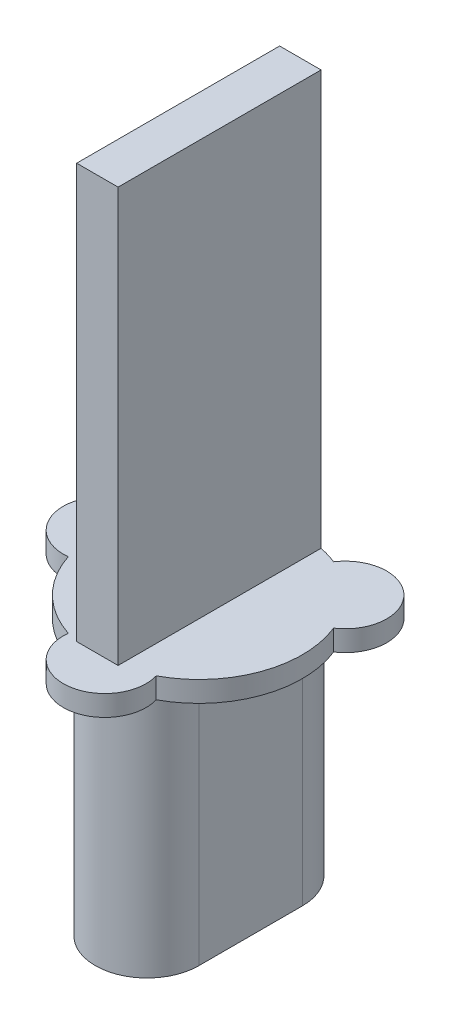
ISO-10303-21;
HEADER;
FILE_DESCRIPTION(('STEP AP214'),'2;1');
FILE_NAME('part.step','',(''),(''),'','','');
FILE_SCHEMA(('AUTOMOTIVE_DESIGN { 1 0 10303 214 1 1 1 1 }'));
ENDSEC;
DATA;
#1=APPLICATION_CONTEXT('core data for automotive mechanical design processes');
#2=APPLICATION_PROTOCOL_DEFINITION('international standard','automotive_design',2000,#1);
#3=PRODUCT_CONTEXT('',#1,'mechanical');
#4=PRODUCT('Part','Part','',(#3));
#5=PRODUCT_RELATED_PRODUCT_CATEGORY('part','',(#4));
#6=PRODUCT_DEFINITION_FORMATION('','',#4);
#7=PRODUCT_DEFINITION_CONTEXT('part definition',#1,'design');
#8=PRODUCT_DEFINITION('design','',#6,#7);
#9=PRODUCT_DEFINITION_SHAPE('','',#8);
#10=(LENGTH_UNIT() NAMED_UNIT(*) SI_UNIT(.MILLI.,.METRE.));
#11=(NAMED_UNIT(*) PLANE_ANGLE_UNIT() SI_UNIT($,.RADIAN.));
#12=(NAMED_UNIT(*) SI_UNIT($,.STERADIAN.) SOLID_ANGLE_UNIT());
#13=UNCERTAINTY_MEASURE_WITH_UNIT(LENGTH_MEASURE(1.E-05),#10,'distance_accuracy_value','');
#14=(GEOMETRIC_REPRESENTATION_CONTEXT(3) GLOBAL_UNCERTAINTY_ASSIGNED_CONTEXT((#13)) GLOBAL_UNIT_ASSIGNED_CONTEXT((#10,
#11,#12)) REPRESENTATION_CONTEXT('',''));
#15=CARTESIAN_POINT('',(0.,0.,0.));
#16=DIRECTION('',(0.,0.,1.));
#17=DIRECTION('',(1.,0.,0.));
#18=AXIS2_PLACEMENT_3D('',#15,#16,#17);
#19=CARTESIAN_POINT('',(0.,0.,-2.5));
#20=DIRECTION('',(0.,1.,0.));
#21=DIRECTION('',(0.,0.,1.));
#22=AXIS2_PLACEMENT_3D('',#19,#20,#21);
#23=PLANE('',#22);
#24=CARTESIAN_POINT('',(0.,0.,0.));
#25=DIRECTION('',(0.,1.,0.));
#26=DIRECTION('',(0.,0.,1.));
#27=AXIS2_PLACEMENT_3D('',#24,#25,#26);
#28=CIRCLE('',#27,5.);
#29=CARTESIAN_POINT('',(1.,0.,-4.89897948556636));
#30=VERTEX_POINT('',#29);
#31=CARTESIAN_POINT('',(-1.,0.,-4.89897948556636));
#32=VERTEX_POINT('',#31);
#33=EDGE_CURVE('E194',#30,#32,#28,.T.);
#34=ORIENTED_EDGE('',*,*,#33,.T.);
#35=DIRECTION('',(1.,0.,0.));
#36=VECTOR('',#35,1.);
#37=CARTESIAN_POINT('',(-0.999999999999999,0.,-4.89897948556636));
#38=LINE('',#37,#36);
#39=EDGE_CURVE('E321',#32,#30,#38,.T.);
#40=ORIENTED_EDGE('',*,*,#39,.T.);
#41=EDGE_LOOP('',(#34,#40));
#42=FACE_BOUND('',#41,.T.);
#43=ADVANCED_FACE('F66',(#42),#23,.T.);
#44=CARTESIAN_POINT('',(0.,-13.,-2.5));
#45=DIRECTION('',(0.,1.,0.));
#46=DIRECTION('',(0.,0.,1.));
#47=AXIS2_PLACEMENT_3D('',#44,#45,#46);
#48=CYLINDRICAL_SURFACE('',#47,2.5);
#49=CARTESIAN_POINT('',(0.,-0.999999999999999,-2.5));
#50=DIRECTION('',(0.,1.,0.));
#51=DIRECTION('',(0.,0.,1.));
#52=AXIS2_PLACEMENT_3D('',#49,#50,#51);
#53=CIRCLE('',#52,2.5);
#54=CARTESIAN_POINT('',(-2.5,-1.,-2.5));
#55=VERTEX_POINT('',#54);
#56=CARTESIAN_POINT('',(0.,-1.,-5.));
#57=VERTEX_POINT('',#56);
#58=EDGE_CURVE('E244',#55,#57,#53,.F.);
#59=ORIENTED_EDGE('',*,*,#58,.T.);
#60=CARTESIAN_POINT('',(2.5,-0.999999999999999,-2.5));
#61=VERTEX_POINT('',#60);
#62=EDGE_CURVE('E247',#57,#61,#53,.F.);
#63=ORIENTED_EDGE('',*,*,#62,.T.);
#64=DIRECTION('',(0.,1.,0.));
#65=VECTOR('',#64,1.);
#66=CARTESIAN_POINT('',(2.5,-13.,-2.5));
#67=LINE('',#66,#65);
#68=CARTESIAN_POINT('',(2.5,-13.,-2.5));
#69=VERTEX_POINT('',#68);
#70=EDGE_CURVE('E74',#69,#61,#67,.T.);
#71=ORIENTED_EDGE('',*,*,#70,.F.);
#72=CARTESIAN_POINT('',(0.,-13.,-2.5));
#73=DIRECTION('',(0.,1.,0.));
#74=DIRECTION('',(0.,0.,1.));
#75=AXIS2_PLACEMENT_3D('',#72,#73,#74);
#76=CIRCLE('',#75,2.5);
#77=CARTESIAN_POINT('',(-2.5,-13.,-2.5));
#78=VERTEX_POINT('',#77);
#79=EDGE_CURVE('E248',#69,#78,#76,.T.);
#80=ORIENTED_EDGE('',*,*,#79,.T.);
#81=DIRECTION('',(0.,1.,0.));
#82=VECTOR('',#81,1.);
#83=CARTESIAN_POINT('',(-2.5,-13.,-2.5));
#84=LINE('',#83,#82);
#85=EDGE_CURVE('E259',#78,#55,#84,.T.);
#86=ORIENTED_EDGE('',*,*,#85,.T.);
#87=EDGE_LOOP('',(#59,#63,#71,#80,#86));
#88=FACE_BOUND('',#87,.T.);
#89=ADVANCED_FACE('F68',(#88),#48,.T.);
#90=CARTESIAN_POINT('',(2.5,-13.,-2.5));
#91=DIRECTION('',(-1.,0.,0.));
#92=DIRECTION('',(0.,0.,1.));
#93=AXIS2_PLACEMENT_3D('',#90,#91,#92);
#94=PLANE('',#93);
#95=DIRECTION('',(0.,0.,-1.));
#96=VECTOR('',#95,1.);
#97=CARTESIAN_POINT('',(2.5,-0.999999999999999,-2.5));
#98=LINE('',#97,#96);
#99=CARTESIAN_POINT('',(2.50000000000001,-0.999999999999999,2.5));
#100=VERTEX_POINT('',#99);
#101=EDGE_CURVE('E242',#100,#61,#98,.T.);
#102=ORIENTED_EDGE('',*,*,#101,.F.);
#103=DIRECTION('',(0.,1.,0.));
#104=VECTOR('',#103,1.);
#105=CARTESIAN_POINT('',(2.50000000000001,-13.,2.5));
#106=LINE('',#105,#104);
#107=CARTESIAN_POINT('',(2.50000000000001,-13.,2.5));
#108=VERTEX_POINT('',#107);
#109=EDGE_CURVE('E262',#108,#100,#106,.T.);
#110=ORIENTED_EDGE('',*,*,#109,.F.);
#111=DIRECTION('',(0.,0.,1.));
#112=VECTOR('',#111,1.);
#113=CARTESIAN_POINT('',(2.5,-13.,-2.5));
#114=LINE('',#113,#112);
#115=EDGE_CURVE('E257',#69,#108,#114,.T.);
#116=ORIENTED_EDGE('',*,*,#115,.F.);
#117=ORIENTED_EDGE('',*,*,#70,.T.);
#118=EDGE_LOOP('',(#102,#110,#116,#117));
#119=FACE_BOUND('',#118,.T.);
#120=ADVANCED_FACE('F285',(#119),#94,.F.);
#121=CARTESIAN_POINT('',(0.,-13.,2.5));
#122=DIRECTION('',(0.,1.,0.));
#123=DIRECTION('',(0.,0.,1.));
#124=AXIS2_PLACEMENT_3D('',#121,#122,#123);
#125=CYLINDRICAL_SURFACE('',#124,2.5);
#126=ORIENTED_EDGE('',*,*,#109,.T.);
#127=CARTESIAN_POINT('',(0.,-0.999999999999999,2.5));
#128=DIRECTION('',(0.,1.,0.));
#129=DIRECTION('',(0.,0.,1.));
#130=AXIS2_PLACEMENT_3D('',#127,#128,#129);
#131=CIRCLE('',#130,2.5);
#132=CARTESIAN_POINT('',(-2.5,-0.999999999999999,2.5));
#133=VERTEX_POINT('',#132);
#134=EDGE_CURVE('E209',#100,#133,#131,.F.);
#135=ORIENTED_EDGE('',*,*,#134,.T.);
#136=DIRECTION('',(0.,1.,0.));
#137=VECTOR('',#136,1.);
#138=CARTESIAN_POINT('',(-2.5,-13.,2.5));
#139=LINE('',#138,#137);
#140=CARTESIAN_POINT('',(-2.5,-13.,2.5));
#141=VERTEX_POINT('',#140);
#142=EDGE_CURVE('E265',#141,#133,#139,.T.);
#143=ORIENTED_EDGE('',*,*,#142,.F.);
#144=CARTESIAN_POINT('',(0.,-13.,2.5));
#145=DIRECTION('',(0.,1.,0.));
#146=DIRECTION('',(0.,0.,1.));
#147=AXIS2_PLACEMENT_3D('',#144,#145,#146);
#148=CIRCLE('',#147,2.5);
#149=EDGE_CURVE('E254',#141,#108,#148,.T.);
#150=ORIENTED_EDGE('',*,*,#149,.T.);
#151=EDGE_LOOP('',(#126,#135,#143,#150));
#152=FACE_BOUND('',#151,.T.);
#153=ADVANCED_FACE('F280',(#152),#125,.T.);
#154=CARTESIAN_POINT('',(-2.5,-13.,-2.5));
#155=DIRECTION('',(-1.,0.,0.));
#156=DIRECTION('',(0.,0.,1.));
#157=AXIS2_PLACEMENT_3D('',#154,#155,#156);
#158=PLANE('',#157);
#159=ORIENTED_EDGE('',*,*,#142,.T.);
#160=DIRECTION('',(0.,0.,-1.));
#161=VECTOR('',#160,1.);
#162=CARTESIAN_POINT('',(-2.5,-0.999999999999999,-2.5));
#163=LINE('',#162,#161);
#164=EDGE_CURVE('E12',#133,#55,#163,.T.);
#165=ORIENTED_EDGE('',*,*,#164,.T.);
#166=ORIENTED_EDGE('',*,*,#85,.F.);
#167=DIRECTION('',(0.,0.,1.));
#168=VECTOR('',#167,1.);
#169=CARTESIAN_POINT('',(-2.5,-13.,-2.5));
#170=LINE('',#169,#168);
#171=EDGE_CURVE('E251',#78,#141,#170,.T.);
#172=ORIENTED_EDGE('',*,*,#171,.T.);
#173=EDGE_LOOP('',(#159,#165,#166,#172));
#174=FACE_BOUND('',#173,.T.);
#175=ADVANCED_FACE('F273',(#174),#158,.T.);
#176=CARTESIAN_POINT('',(0.,-13.,-2.5));
#177=DIRECTION('',(0.,1.,0.));
#178=DIRECTION('',(0.,0.,1.));
#179=AXIS2_PLACEMENT_3D('',#176,#177,#178);
#180=PLANE('',#179);
#181=ORIENTED_EDGE('',*,*,#79,.F.);
#182=ORIENTED_EDGE('',*,*,#115,.T.);
#183=ORIENTED_EDGE('',*,*,#149,.F.);
#184=ORIENTED_EDGE('',*,*,#171,.F.);
#185=EDGE_LOOP('',(#181,#182,#183,#184));
#186=FACE_BOUND('',#185,.T.);
#187=ADVANCED_FACE('F276',(#186),#180,.F.);
#188=CARTESIAN_POINT('',(0.,-1.,0.));
#189=DIRECTION('',(0.,1.,0.));
#190=DIRECTION('',(0.,0.,1.));
#191=AXIS2_PLACEMENT_3D('',#188,#189,#190);
#192=CYLINDRICAL_SURFACE('',#191,5.);
#193=DIRECTION('',(0.,1.,0.));
#194=VECTOR('',#193,1.);
#195=CARTESIAN_POINT('',(-4.41170593291399,-1.,-2.35305137247182));
#196=LINE('',#195,#194);
#197=CARTESIAN_POINT('',(-4.41170593291399,-1.,-2.35305137247182));
#198=VERTEX_POINT('',#197);
#199=CARTESIAN_POINT('',(-4.41170593291399,0.,-2.35305137247182));
#200=VERTEX_POINT('',#199);
#201=EDGE_CURVE('E214',#198,#200,#196,.T.);
#202=ORIENTED_EDGE('',*,*,#201,.T.);
#203=EDGE_CURVE('E239',#32,#200,#28,.T.);
#204=ORIENTED_EDGE('',*,*,#203,.F.);
#205=ORIENTED_EDGE('',*,*,#33,.F.);
#206=CARTESIAN_POINT('',(1.86705054740302,0.,-4.63833183951322));
#207=VERTEX_POINT('',#206);
#208=EDGE_CURVE('E236',#207,#30,#28,.T.);
#209=ORIENTED_EDGE('',*,*,#208,.F.);
#210=DIRECTION('',(0.,1.,0.));
#211=VECTOR('',#210,1.);
#212=CARTESIAN_POINT('',(1.86705054740302,-1.,-4.63833183951322));
#213=LINE('',#212,#211);
#214=CARTESIAN_POINT('',(1.86705054740302,-1.,-4.63833183951322));
#215=VERTEX_POINT('',#214);
#216=EDGE_CURVE('E218',#215,#207,#213,.T.);
#217=ORIENTED_EDGE('',*,*,#216,.F.);
#218=CARTESIAN_POINT('',(0.,-1.,0.));
#219=DIRECTION('',(0.,1.,0.));
#220=DIRECTION('',(0.,0.,1.));
#221=AXIS2_PLACEMENT_3D('',#218,#219,#220);
#222=CIRCLE('',#221,5.);
#223=EDGE_CURVE('E229',#215,#57,#222,.T.);
#224=ORIENTED_EDGE('',*,*,#223,.T.);
#225=EDGE_CURVE('E234',#57,#198,#222,.T.);
#226=ORIENTED_EDGE('',*,*,#225,.T.);
#227=EDGE_LOOP('',(#202,#204,#205,#209,#217,#224,#226));
#228=FACE_BOUND('',#227,.T.);
#229=ADVANCED_FACE('F293',(#228),#192,.T.);
#230=CARTESIAN_POINT('',(0.435778713738293,-1.,4.98097349045873));
#231=DIRECTION('',(0.,1.,0.));
#232=DIRECTION('',(0.,0.,1.));
#233=AXIS2_PLACEMENT_3D('',#230,#231,#232);
#234=CYLINDRICAL_SURFACE('',#233,2.);
#235=CARTESIAN_POINT('',(0.435778713738293,0.,4.98097349045873));
#236=DIRECTION('',(0.,1.,0.));
#237=DIRECTION('',(0.,0.,1.));
#238=AXIS2_PLACEMENT_3D('',#235,#236,#237);
#239=CIRCLE('',#238,2.);
#240=CARTESIAN_POINT('',(-1.55121853919334,0.,4.75328528953006));
#241=VERTEX_POINT('',#240);
#242=CARTESIAN_POINT('',(2.3530513724718,0.,4.411705932914));
#243=VERTEX_POINT('',#242);
#244=EDGE_CURVE('E203',#241,#243,#239,.T.);
#245=ORIENTED_EDGE('',*,*,#244,.F.);
#246=DIRECTION('',(0.,1.,0.));
#247=VECTOR('',#246,1.);
#248=CARTESIAN_POINT('',(-1.55121853919334,-1.,4.75328528953006));
#249=LINE('',#248,#247);
#250=CARTESIAN_POINT('',(-1.55121853919334,-1.,4.75328528953006));
#251=VERTEX_POINT('',#250);
#252=EDGE_CURVE('E202',#251,#241,#249,.T.);
#253=ORIENTED_EDGE('',*,*,#252,.F.);
#254=CARTESIAN_POINT('',(0.435778713738293,-1.,4.98097349045873));
#255=DIRECTION('',(0.,1.,0.));
#256=DIRECTION('',(0.,0.,1.));
#257=AXIS2_PLACEMENT_3D('',#254,#255,#256);
#258=CIRCLE('',#257,2.);
#259=CARTESIAN_POINT('',(2.3530513724718,-1.,4.411705932914));
#260=VERTEX_POINT('',#259);
#261=EDGE_CURVE('E199',#251,#260,#258,.T.);
#262=ORIENTED_EDGE('',*,*,#261,.T.);
#263=DIRECTION('',(0.,1.,0.));
#264=VECTOR('',#263,1.);
#265=CARTESIAN_POINT('',(2.3530513724718,-1.,4.411705932914));
#266=LINE('',#265,#264);
#267=EDGE_CURVE('E207',#260,#243,#266,.T.);
#268=ORIENTED_EDGE('',*,*,#267,.T.);
#269=EDGE_LOOP('',(#245,#253,#262,#268));
#270=FACE_BOUND('',#269,.T.);
#271=ADVANCED_FACE('F305',(#270),#234,.T.);
#272=CARTESIAN_POINT('',(0.,-1.,0.));
#273=DIRECTION('',(0.,1.,0.));
#274=DIRECTION('',(0.,0.,1.));
#275=AXIS2_PLACEMENT_3D('',#272,#273,#274);
#276=PLANE('',#275);
#277=ORIENTED_EDGE('',*,*,#62,.F.);
#278=ORIENTED_EDGE('',*,*,#223,.F.);
#279=CARTESIAN_POINT('',(3.53553390593274,-1.,-3.53553390593274));
#280=DIRECTION('',(0.,1.,0.));
#281=DIRECTION('',(0.,0.,1.));
#282=AXIS2_PLACEMENT_3D('',#279,#280,#281);
#283=CIRCLE('',#282,2.);
#284=CARTESIAN_POINT('',(4.63833183951322,-1.,-1.86705054740301));
#285=VERTEX_POINT('',#284);
#286=EDGE_CURVE('E222',#285,#215,#283,.T.);
#287=ORIENTED_EDGE('',*,*,#286,.F.);
#288=EDGE_CURVE('E238',#260,#285,#222,.T.);
#289=ORIENTED_EDGE('',*,*,#288,.F.);
#290=ORIENTED_EDGE('',*,*,#261,.F.);
#291=CARTESIAN_POINT('',(-4.75328528953006,-1.,1.55121853919333));
#292=VERTEX_POINT('',#291);
#293=EDGE_CURVE('E235',#292,#251,#222,.T.);
#294=ORIENTED_EDGE('',*,*,#293,.F.);
#295=CARTESIAN_POINT('',(-4.98097349045873,-1.,-0.435778713738309));
#296=DIRECTION('',(0.,1.,0.));
#297=DIRECTION('',(0.,0.,1.));
#298=AXIS2_PLACEMENT_3D('',#295,#296,#297);
#299=CIRCLE('',#298,2.);
#300=EDGE_CURVE('E211',#198,#292,#299,.T.);
#301=ORIENTED_EDGE('',*,*,#300,.F.);
#302=ORIENTED_EDGE('',*,*,#225,.F.);
#303=ORIENTED_EDGE('',*,*,#58,.F.);
#304=ORIENTED_EDGE('',*,*,#164,.F.);
#305=ORIENTED_EDGE('',*,*,#134,.F.);
#306=ORIENTED_EDGE('',*,*,#101,.T.);
#307=EDGE_LOOP('',(#277,#278,#287,#289,#290,#294,#301,#302,#303,#304,#305,#306));
#308=FACE_BOUND('',#307,.T.);
#309=ADVANCED_FACE('F283',(#308),#276,.F.);
#310=CARTESIAN_POINT('',(-4.98097349045873,-1.,-0.435778713738309));
#311=DIRECTION('',(0.,1.,0.));
#312=DIRECTION('',(0.,0.,1.));
#313=AXIS2_PLACEMENT_3D('',#310,#311,#312);
#314=CYLINDRICAL_SURFACE('',#313,2.);
#315=CARTESIAN_POINT('',(-4.98097349045873,0.,-0.435778713738309));
#316=DIRECTION('',(0.,1.,0.));
#317=DIRECTION('',(0.,0.,1.));
#318=AXIS2_PLACEMENT_3D('',#315,#316,#317);
#319=CIRCLE('',#318,2.);
#320=CARTESIAN_POINT('',(-4.75328528953006,0.,1.55121853919333));
#321=VERTEX_POINT('',#320);
#322=EDGE_CURVE('E215',#200,#321,#319,.T.);
#323=ORIENTED_EDGE('',*,*,#322,.F.);
#324=ORIENTED_EDGE('',*,*,#201,.F.);
#325=ORIENTED_EDGE('',*,*,#300,.T.);
#326=DIRECTION('',(0.,1.,0.));
#327=VECTOR('',#326,1.);
#328=CARTESIAN_POINT('',(-4.75328528953006,-1.,1.55121853919333));
#329=LINE('',#328,#327);
#330=EDGE_CURVE('E206',#292,#321,#329,.T.);
#331=ORIENTED_EDGE('',*,*,#330,.T.);
#332=EDGE_LOOP('',(#323,#324,#325,#331));
#333=FACE_BOUND('',#332,.T.);
#334=ADVANCED_FACE('F314',(#333),#314,.T.);
#335=CARTESIAN_POINT('',(3.53553390593274,-1.,-3.53553390593274));
#336=DIRECTION('',(0.,1.,0.));
#337=DIRECTION('',(0.,0.,1.));
#338=AXIS2_PLACEMENT_3D('',#335,#336,#337);
#339=CYLINDRICAL_SURFACE('',#338,2.);
#340=CARTESIAN_POINT('',(3.53553390593274,0.,-3.53553390593274));
#341=DIRECTION('',(0.,1.,0.));
#342=DIRECTION('',(0.,0.,1.));
#343=AXIS2_PLACEMENT_3D('',#340,#341,#342);
#344=CIRCLE('',#343,2.);
#345=CARTESIAN_POINT('',(4.63833183951322,0.,-1.86705054740301));
#346=VERTEX_POINT('',#345);
#347=EDGE_CURVE('E226',#346,#207,#344,.T.);
#348=ORIENTED_EDGE('',*,*,#347,.F.);
#349=DIRECTION('',(0.,1.,0.));
#350=VECTOR('',#349,1.);
#351=CARTESIAN_POINT('',(4.63833183951322,-1.,-1.86705054740301));
#352=LINE('',#351,#350);
#353=EDGE_CURVE('E225',#285,#346,#352,.T.);
#354=ORIENTED_EDGE('',*,*,#353,.F.);
#355=ORIENTED_EDGE('',*,*,#286,.T.);
#356=ORIENTED_EDGE('',*,*,#216,.T.);
#357=EDGE_LOOP('',(#348,#354,#355,#356));
#358=FACE_BOUND('',#357,.T.);
#359=ADVANCED_FACE('F298',(#358),#339,.T.);
#360=EDGE_CURVE('E190',#243,#346,#28,.T.);
#361=ORIENTED_EDGE('',*,*,#360,.F.);
#362=ORIENTED_EDGE('',*,*,#267,.F.);
#363=ORIENTED_EDGE('',*,*,#288,.T.);
#364=ORIENTED_EDGE('',*,*,#353,.T.);
#365=EDGE_LOOP('',(#361,#362,#363,#364));
#366=FACE_BOUND('',#365,.T.);
#367=ADVANCED_FACE('F343',(#366),#192,.T.);
#368=ORIENTED_EDGE('',*,*,#293,.T.);
#369=ORIENTED_EDGE('',*,*,#252,.T.);
#370=EDGE_CURVE('E192',#321,#241,#28,.T.);
#371=ORIENTED_EDGE('',*,*,#370,.F.);
#372=ORIENTED_EDGE('',*,*,#330,.F.);
#373=EDGE_LOOP('',(#368,#369,#371,#372));
#374=FACE_BOUND('',#373,.T.);
#375=ADVANCED_FACE('F311',(#374),#192,.T.);
#376=DIRECTION('',(1.,0.,0.));
#377=VECTOR('',#376,1.);
#378=CARTESIAN_POINT('',(-0.999999999999999,0.,4.89897948556636));
#379=LINE('',#378,#377);
#380=CARTESIAN_POINT('',(-0.999999999999999,0.,4.89897948556636));
#381=VERTEX_POINT('',#380);
#382=CARTESIAN_POINT('',(1.,0.,4.89897948556636));
#383=VERTEX_POINT('',#382);
#384=EDGE_CURVE('E81',#381,#383,#379,.T.);
#385=ORIENTED_EDGE('',*,*,#384,.F.);
#386=DIRECTION('',(0.,0.,-1.));
#387=VECTOR('',#386,1.);
#388=CARTESIAN_POINT('',(-0.999999999999999,0.,4.89897948556636));
#389=LINE('',#388,#387);
#390=EDGE_CURVE('E187',#381,#32,#389,.T.);
#391=ORIENTED_EDGE('',*,*,#390,.T.);
#392=ORIENTED_EDGE('',*,*,#203,.T.);
#393=ORIENTED_EDGE('',*,*,#322,.T.);
#394=ORIENTED_EDGE('',*,*,#370,.T.);
#395=ORIENTED_EDGE('',*,*,#244,.T.);
#396=ORIENTED_EDGE('',*,*,#360,.T.);
#397=ORIENTED_EDGE('',*,*,#347,.T.);
#398=ORIENTED_EDGE('',*,*,#208,.T.);
#399=DIRECTION('',(0.,0.,-1.));
#400=VECTOR('',#399,1.);
#401=CARTESIAN_POINT('',(1.,0.,4.89897948556636));
#402=LINE('',#401,#400);
#403=EDGE_CURVE('E86',#383,#30,#402,.T.);
#404=ORIENTED_EDGE('',*,*,#403,.F.);
#405=EDGE_LOOP('',(#385,#391,#392,#393,#394,#395,#396,#397,#398,#404));
#406=FACE_BOUND('',#405,.T.);
#407=ADVANCED_FACE('F335',(#406),#23,.T.);
#408=CARTESIAN_POINT('',(-0.999999999999999,20.,4.89897948556636));
#409=DIRECTION('',(0.,0.,-1.));
#410=DIRECTION('',(-1.,0.,0.));
#411=AXIS2_PLACEMENT_3D('',#408,#409,#410);
#412=PLANE('',#411);
#413=ORIENTED_EDGE('',*,*,#384,.T.);
#414=DIRECTION('',(0.,-1.,0.));
#415=VECTOR('',#414,1.);
#416=CARTESIAN_POINT('',(1.,20.,4.89897948556636));
#417=LINE('',#416,#415);
#418=CARTESIAN_POINT('',(1.,20.,4.89897948556636));
#419=VERTEX_POINT('',#418);
#420=EDGE_CURVE('E172',#419,#383,#417,.T.);
#421=ORIENTED_EDGE('',*,*,#420,.F.);
#422=DIRECTION('',(1.,0.,0.));
#423=VECTOR('',#422,1.);
#424=CARTESIAN_POINT('',(-0.999999999999999,20.,4.89897948556636));
#425=LINE('',#424,#423);
#426=CARTESIAN_POINT('',(-0.999999999999999,20.,4.89897948556636));
#427=VERTEX_POINT('',#426);
#428=EDGE_CURVE('E179',#427,#419,#425,.T.);
#429=ORIENTED_EDGE('',*,*,#428,.F.);
#430=DIRECTION('',(0.,-1.,0.));
#431=VECTOR('',#430,1.);
#432=CARTESIAN_POINT('',(-0.999999999999999,20.,4.89897948556636));
#433=LINE('',#432,#431);
#434=EDGE_CURVE('E326',#427,#381,#433,.T.);
#435=ORIENTED_EDGE('',*,*,#434,.T.);
#436=EDGE_LOOP('',(#413,#421,#429,#435));
#437=FACE_BOUND('',#436,.T.);
#438=ADVANCED_FACE('F189',(#437),#412,.F.);
#439=CARTESIAN_POINT('',(1.,20.,4.89897948556636));
#440=DIRECTION('',(-1.,0.,0.));
#441=DIRECTION('',(0.,0.,1.));
#442=AXIS2_PLACEMENT_3D('',#439,#440,#441);
#443=PLANE('',#442);
#444=ORIENTED_EDGE('',*,*,#403,.T.);
#445=DIRECTION('',(0.,-1.,0.));
#446=VECTOR('',#445,1.);
#447=CARTESIAN_POINT('',(1.,20.,-4.89897948556636));
#448=LINE('',#447,#446);
#449=CARTESIAN_POINT('',(1.,20.,-4.89897948556636));
#450=VERTEX_POINT('',#449);
#451=EDGE_CURVE('E174',#450,#30,#448,.T.);
#452=ORIENTED_EDGE('',*,*,#451,.F.);
#453=DIRECTION('',(0.,0.,-1.));
#454=VECTOR('',#453,1.);
#455=CARTESIAN_POINT('',(1.,20.,4.89897948556636));
#456=LINE('',#455,#454);
#457=EDGE_CURVE('E168',#419,#450,#456,.T.);
#458=ORIENTED_EDGE('',*,*,#457,.F.);
#459=ORIENTED_EDGE('',*,*,#420,.T.);
#460=EDGE_LOOP('',(#444,#452,#458,#459));
#461=FACE_BOUND('',#460,.T.);
#462=ADVANCED_FACE('F170',(#461),#443,.F.);
#463=CARTESIAN_POINT('',(-0.999999999999999,20.,-4.89897948556636));
#464=DIRECTION('',(0.,0.,-1.));
#465=DIRECTION('',(-1.,0.,0.));
#466=AXIS2_PLACEMENT_3D('',#463,#464,#465);
#467=PLANE('',#466);
#468=ORIENTED_EDGE('',*,*,#39,.F.);
#469=DIRECTION('',(0.,-1.,0.));
#470=VECTOR('',#469,1.);
#471=CARTESIAN_POINT('',(-0.999999999999999,20.,-4.89897948556636));
#472=LINE('',#471,#470);
#473=CARTESIAN_POINT('',(-0.999999999999999,20.,-4.89897948556636));
#474=VERTEX_POINT('',#473);
#475=EDGE_CURVE('E195',#474,#32,#472,.T.);
#476=ORIENTED_EDGE('',*,*,#475,.F.);
#477=DIRECTION('',(1.,0.,0.));
#478=VECTOR('',#477,1.);
#479=CARTESIAN_POINT('',(-0.999999999999999,20.,-4.89897948556636));
#480=LINE('',#479,#478);
#481=EDGE_CURVE('E178',#474,#450,#480,.T.);
#482=ORIENTED_EDGE('',*,*,#481,.T.);
#483=ORIENTED_EDGE('',*,*,#451,.T.);
#484=EDGE_LOOP('',(#468,#476,#482,#483));
#485=FACE_BOUND('',#484,.T.);
#486=ADVANCED_FACE('F327',(#485),#467,.T.);
#487=CARTESIAN_POINT('',(-0.999999999999999,20.,4.89897948556636));
#488=DIRECTION('',(-1.,0.,0.));
#489=DIRECTION('',(0.,0.,1.));
#490=AXIS2_PLACEMENT_3D('',#487,#488,#489);
#491=PLANE('',#490);
#492=ORIENTED_EDGE('',*,*,#390,.F.);
#493=ORIENTED_EDGE('',*,*,#434,.F.);
#494=DIRECTION('',(0.,0.,-1.));
#495=VECTOR('',#494,1.);
#496=CARTESIAN_POINT('',(-0.999999999999999,20.,4.89897948556636));
#497=LINE('',#496,#495);
#498=EDGE_CURVE('E185',#427,#474,#497,.T.);
#499=ORIENTED_EDGE('',*,*,#498,.T.);
#500=ORIENTED_EDGE('',*,*,#475,.T.);
#501=EDGE_LOOP('',(#492,#493,#499,#500));
#502=FACE_BOUND('',#501,.T.);
#503=ADVANCED_FACE('F324',(#502),#491,.T.);
#504=CARTESIAN_POINT('',(0.,20.,0.));
#505=DIRECTION('',(0.,1.,0.));
#506=DIRECTION('',(0.,0.,1.));
#507=AXIS2_PLACEMENT_3D('',#504,#505,#506);
#508=PLANE('',#507);
#509=ORIENTED_EDGE('',*,*,#428,.T.);
#510=ORIENTED_EDGE('',*,*,#457,.T.);
#511=ORIENTED_EDGE('',*,*,#481,.F.);
#512=ORIENTED_EDGE('',*,*,#498,.F.);
#513=EDGE_LOOP('',(#509,#510,#511,#512));
#514=FACE_BOUND('',#513,.T.);
#515=ADVANCED_FACE('F183',(#514),#508,.T.);
#516=CLOSED_SHELL('',(#43,#89,#120,#153,#175,#187,#229,#271,#309,#334,#359,#367,#375,#407,#438,
#462,#486,#503,#515));
#517=MANIFOLD_SOLID_BREP('B2',#516);
#518=ADVANCED_BREP_SHAPE_REPRESENTATION('',(#18,#517),#14);
#519=SHAPE_DEFINITION_REPRESENTATION(#9,#518);
ENDSEC;
END-ISO-10303-21;
